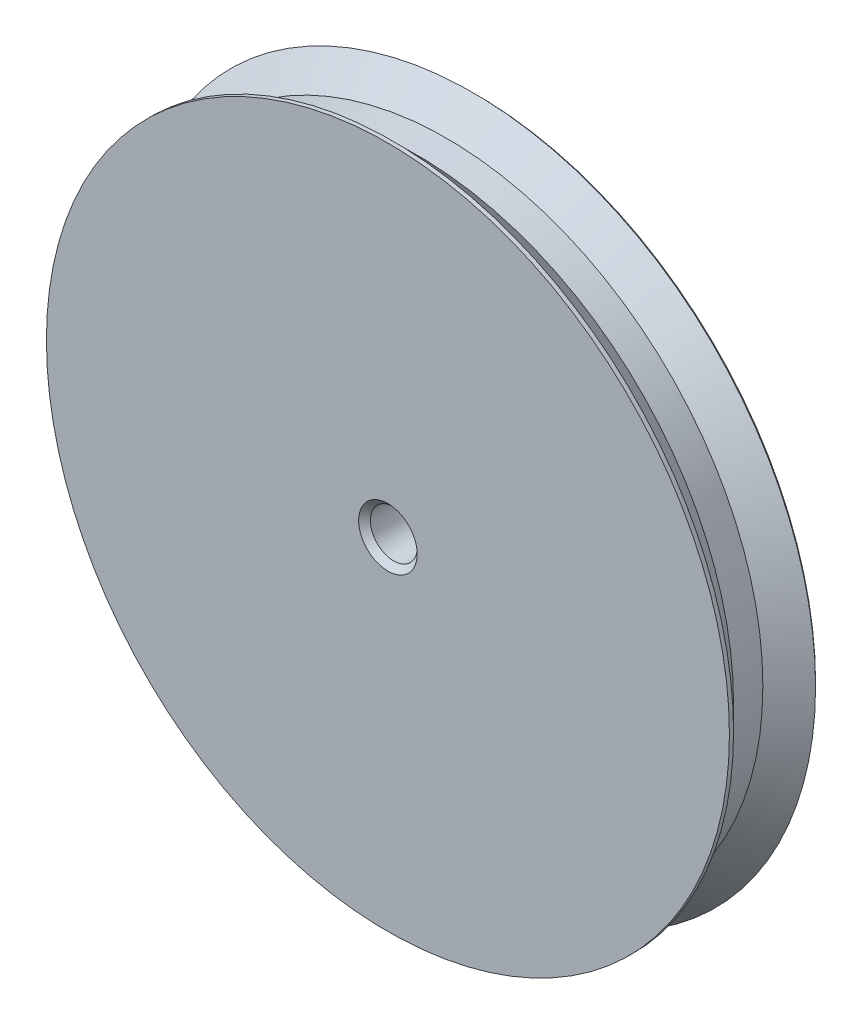
ISO-10303-21;
HEADER;
FILE_DESCRIPTION(('STEP AP214'),'2;1');
FILE_NAME('part.step','',(''),(''),'','','');
FILE_SCHEMA(('AUTOMOTIVE_DESIGN { 1 0 10303 214 1 1 1 1 }'));
ENDSEC;
DATA;
#1=APPLICATION_CONTEXT('core data for automotive mechanical design processes');
#2=APPLICATION_PROTOCOL_DEFINITION('international standard','automotive_design',2000,#1);
#3=PRODUCT_CONTEXT('',#1,'mechanical');
#4=PRODUCT('Part','Part','',(#3));
#5=PRODUCT_RELATED_PRODUCT_CATEGORY('part','',(#4));
#6=PRODUCT_DEFINITION_FORMATION('','',#4);
#7=PRODUCT_DEFINITION_CONTEXT('part definition',#1,'design');
#8=PRODUCT_DEFINITION('design','',#6,#7);
#9=PRODUCT_DEFINITION_SHAPE('','',#8);
#10=(LENGTH_UNIT() NAMED_UNIT(*) SI_UNIT(.MILLI.,.METRE.));
#11=(NAMED_UNIT(*) PLANE_ANGLE_UNIT() SI_UNIT($,.RADIAN.));
#12=(NAMED_UNIT(*) SI_UNIT($,.STERADIAN.) SOLID_ANGLE_UNIT());
#13=UNCERTAINTY_MEASURE_WITH_UNIT(LENGTH_MEASURE(1.E-05),#10,'distance_accuracy_value','');
#14=(GEOMETRIC_REPRESENTATION_CONTEXT(3) GLOBAL_UNCERTAINTY_ASSIGNED_CONTEXT((#13)) GLOBAL_UNIT_ASSIGNED_CONTEXT((#10,
#11,#12)) REPRESENTATION_CONTEXT('',''));
#15=CARTESIAN_POINT('',(0.,0.,0.));
#16=DIRECTION('',(0.,0.,1.));
#17=DIRECTION('',(1.,0.,0.));
#18=AXIS2_PLACEMENT_3D('',#15,#16,#17);
#19=CARTESIAN_POINT('',(0.,0.,0.));
#20=DIRECTION('',(0.,0.,1.));
#21=DIRECTION('',(1.,0.,0.));
#22=AXIS2_PLACEMENT_3D('',#19,#20,#21);
#23=CYLINDRICAL_SURFACE('',#22,4.);
#24=CARTESIAN_POINT('',(0.,0.,-14.));
#25=DIRECTION('',(0.,0.,-1.));
#26=DIRECTION('',(-1.,0.,0.));
#27=AXIS2_PLACEMENT_3D('',#24,#25,#26);
#28=CIRCLE('',#27,4.);
#29=CARTESIAN_POINT('',(-4.,0.,-14.));
#30=VERTEX_POINT('',#29);
#31=EDGE_CURVE('E58',#30,#30,#28,.T.);
#32=ORIENTED_EDGE('',*,*,#31,.T.);
#33=EDGE_LOOP('',(#32));
#34=FACE_BOUND('',#33,.T.);
#35=CARTESIAN_POINT('',(0.,0.,-1.00000000000003));
#36=DIRECTION('',(0.,0.,1.));
#37=DIRECTION('',(1.,0.,0.));
#38=AXIS2_PLACEMENT_3D('',#35,#36,#37);
#39=CIRCLE('',#38,4.);
#40=CARTESIAN_POINT('',(4.,0.,-1.00000000000003));
#41=VERTEX_POINT('',#40);
#42=EDGE_CURVE('E64',#41,#41,#39,.T.);
#43=ORIENTED_EDGE('',*,*,#42,.T.);
#44=EDGE_LOOP('',(#43));
#45=FACE_BOUND('',#44,.T.);
#46=ADVANCED_FACE('F39',(#34,#45),#23,.F.);
#47=CARTESIAN_POINT('',(4.,0.,-15.));
#48=DIRECTION('',(0.,0.,-1.));
#49=DIRECTION('',(-1.,0.,0.));
#50=AXIS2_PLACEMENT_3D('',#47,#48,#49);
#51=PLANE('',#50);
#52=CARTESIAN_POINT('',(0.,0.,-15.));
#53=DIRECTION('',(0.,0.,-1.));
#54=DIRECTION('',(-1.,0.,0.));
#55=AXIS2_PLACEMENT_3D('',#52,#53,#54);
#56=CIRCLE('',#55,57.9999999999999);
#57=CARTESIAN_POINT('',(-57.9999999999999,0.,-15.));
#58=VERTEX_POINT('',#57);
#59=EDGE_CURVE('E68',#58,#58,#56,.T.);
#60=ORIENTED_EDGE('',*,*,#59,.T.);
#61=EDGE_LOOP('',(#60));
#62=FACE_BOUND('',#61,.T.);
#63=CARTESIAN_POINT('',(0.,0.,-15.));
#64=DIRECTION('',(0.,0.,-1.));
#65=DIRECTION('',(-1.,0.,0.));
#66=AXIS2_PLACEMENT_3D('',#63,#64,#65);
#67=CIRCLE('',#66,4.99999999999999);
#68=CARTESIAN_POINT('',(-4.99999999999999,0.,-15.));
#69=VERTEX_POINT('',#68);
#70=EDGE_CURVE('E72',#69,#69,#67,.F.);
#71=ORIENTED_EDGE('',*,*,#70,.T.);
#72=EDGE_LOOP('',(#71));
#73=FACE_BOUND('',#72,.T.);
#74=ADVANCED_FACE('F102',(#62,#73),#51,.T.);
#75=CARTESIAN_POINT('',(0.,0.,-10.));
#76=DIRECTION('',(0.,0.,-1.));
#77=DIRECTION('',(-1.,0.,0.));
#78=AXIS2_PLACEMENT_3D('',#75,#76,#77);
#79=CONICAL_SURFACE('',#78,54.,0.785398163397448);
#80=CARTESIAN_POINT('',(0.,0.,-14.5));
#81=DIRECTION('',(0.,0.,1.));
#82=DIRECTION('',(1.,0.,0.));
#83=AXIS2_PLACEMENT_3D('',#80,#81,#82);
#84=CIRCLE('',#83,58.5);
#85=CARTESIAN_POINT('',(58.5,0.,-14.5));
#86=VERTEX_POINT('',#85);
#87=EDGE_CURVE('E76',#86,#86,#84,.T.);
#88=ORIENTED_EDGE('',*,*,#87,.T.);
#89=EDGE_LOOP('',(#88));
#90=FACE_BOUND('',#89,.T.);
#91=CARTESIAN_POINT('',(0.,0.,-10.));
#92=DIRECTION('',(0.,0.,1.));
#93=DIRECTION('',(1.,0.,0.));
#94=AXIS2_PLACEMENT_3D('',#91,#92,#93);
#95=CIRCLE('',#94,54.);
#96=CARTESIAN_POINT('',(54.,0.,-10.));
#97=VERTEX_POINT('',#96);
#98=EDGE_CURVE('E80',#97,#97,#95,.T.);
#99=ORIENTED_EDGE('',*,*,#98,.F.);
#100=EDGE_LOOP('',(#99));
#101=FACE_BOUND('',#100,.T.);
#102=ADVANCED_FACE('F93',(#90,#101),#79,.T.);
#103=CARTESIAN_POINT('',(0.,0.,0.));
#104=DIRECTION('',(0.,0.,1.));
#105=DIRECTION('',(1.,0.,0.));
#106=AXIS2_PLACEMENT_3D('',#103,#104,#105);
#107=CYLINDRICAL_SURFACE('',#106,54.);
#108=ORIENTED_EDGE('',*,*,#98,.T.);
#109=EDGE_LOOP('',(#108));
#110=FACE_BOUND('',#109,.T.);
#111=CARTESIAN_POINT('',(0.,0.,-5.));
#112=DIRECTION('',(0.,0.,1.));
#113=DIRECTION('',(1.,0.,0.));
#114=AXIS2_PLACEMENT_3D('',#111,#112,#113);
#115=CIRCLE('',#114,54.);
#116=CARTESIAN_POINT('',(54.,0.,-5.));
#117=VERTEX_POINT('',#116);
#118=EDGE_CURVE('E84',#117,#117,#115,.T.);
#119=ORIENTED_EDGE('',*,*,#118,.F.);
#120=EDGE_LOOP('',(#119));
#121=FACE_BOUND('',#120,.T.);
#122=ADVANCED_FACE('F91',(#110,#121),#107,.T.);
#123=CARTESIAN_POINT('',(0.,0.,0.));
#124=DIRECTION('',(0.,0.,1.));
#125=DIRECTION('',(1.,0.,0.));
#126=AXIS2_PLACEMENT_3D('',#123,#124,#125);
#127=CONICAL_SURFACE('',#126,59.,0.785398163397447);
#128=CARTESIAN_POINT('',(0.,0.,-0.707106781186552));
#129=DIRECTION('',(0.,0.,-1.));
#130=DIRECTION('',(-1.,0.,0.));
#131=AXIS2_PLACEMENT_3D('',#128,#129,#130);
#132=CIRCLE('',#131,58.2928932188134);
#133=CARTESIAN_POINT('',(-58.2928932188134,0.,-0.707106781186552));
#134=VERTEX_POINT('',#133);
#135=EDGE_CURVE('E10',#134,#134,#132,.T.);
#136=ORIENTED_EDGE('',*,*,#135,.T.);
#137=EDGE_LOOP('',(#136));
#138=FACE_BOUND('',#137,.T.);
#139=ORIENTED_EDGE('',*,*,#118,.T.);
#140=EDGE_LOOP('',(#139));
#141=FACE_BOUND('',#140,.T.);
#142=ADVANCED_FACE('F89',(#138,#141),#127,.T.);
#143=CARTESIAN_POINT('',(4.,0.,0.));
#144=DIRECTION('',(0.,0.,1.));
#145=DIRECTION('',(1.,0.,0.));
#146=AXIS2_PLACEMENT_3D('',#143,#144,#145);
#147=PLANE('',#146);
#148=CARTESIAN_POINT('',(0.,0.,0.));
#149=DIRECTION('',(0.,0.,1.));
#150=DIRECTION('',(1.,0.,0.));
#151=AXIS2_PLACEMENT_3D('',#148,#149,#150);
#152=CIRCLE('',#151,5.00000000000003);
#153=CARTESIAN_POINT('',(5.00000000000003,0.,0.));
#154=VERTEX_POINT('',#153);
#155=EDGE_CURVE('E48',#154,#154,#152,.F.);
#156=ORIENTED_EDGE('',*,*,#155,.T.);
#157=EDGE_LOOP('',(#156));
#158=FACE_BOUND('',#157,.T.);
#159=CARTESIAN_POINT('',(0.,0.,0.));
#160=DIRECTION('',(0.,0.,1.));
#161=DIRECTION('',(1.,0.,0.));
#162=AXIS2_PLACEMENT_3D('',#159,#160,#161);
#163=CIRCLE('',#162,58.2928932188134);
#164=CARTESIAN_POINT('',(58.2928932188134,0.,0.));
#165=VERTEX_POINT('',#164);
#166=EDGE_CURVE('E53',#165,#165,#163,.T.);
#167=ORIENTED_EDGE('',*,*,#166,.T.);
#168=EDGE_LOOP('',(#167));
#169=FACE_BOUND('',#168,.T.);
#170=ADVANCED_FACE('F100',(#158,#169),#147,.T.);
#171=CARTESIAN_POINT('',(0.,0.,-14.5));
#172=DIRECTION('',(0.,0.,1.));
#173=DIRECTION('',(1.,0.,0.));
#174=AXIS2_PLACEMENT_3D('',#171,#172,#173);
#175=CONICAL_SURFACE('',#174,58.5,0.785398163397448);
#176=ORIENTED_EDGE('',*,*,#59,.F.);
#177=EDGE_LOOP('',(#176));
#178=FACE_BOUND('',#177,.T.);
#179=ORIENTED_EDGE('',*,*,#87,.F.);
#180=EDGE_LOOP('',(#179));
#181=FACE_BOUND('',#180,.T.);
#182=ADVANCED_FACE('F116',(#178,#181),#175,.T.);
#183=CARTESIAN_POINT('',(0.,0.,-15.));
#184=DIRECTION('',(0.,0.,-1.));
#185=DIRECTION('',(-1.,0.,0.));
#186=AXIS2_PLACEMENT_3D('',#183,#184,#185);
#187=CONICAL_SURFACE('',#186,4.99999999999999,0.785398163397441);
#188=ORIENTED_EDGE('',*,*,#31,.F.);
#189=EDGE_LOOP('',(#188));
#190=FACE_BOUND('',#189,.T.);
#191=ORIENTED_EDGE('',*,*,#70,.F.);
#192=EDGE_LOOP('',(#191));
#193=FACE_BOUND('',#192,.T.);
#194=ADVANCED_FACE('F122',(#190,#193),#187,.F.);
#195=CARTESIAN_POINT('',(0.,0.,-1.00000000000003));
#196=DIRECTION('',(0.,0.,1.));
#197=DIRECTION('',(1.,0.,0.));
#198=AXIS2_PLACEMENT_3D('',#195,#196,#197);
#199=CONICAL_SURFACE('',#198,4.,0.785398163397448);
#200=ORIENTED_EDGE('',*,*,#155,.F.);
#201=EDGE_LOOP('',(#200));
#202=FACE_BOUND('',#201,.T.);
#203=ORIENTED_EDGE('',*,*,#42,.F.);
#204=EDGE_LOOP('',(#203));
#205=FACE_BOUND('',#204,.T.);
#206=ADVANCED_FACE('F128',(#202,#205),#199,.F.);
#207=CARTESIAN_POINT('',(0.,0.,0.));
#208=DIRECTION('',(0.,0.,1.));
#209=DIRECTION('',(1.,0.,0.));
#210=AXIS2_PLACEMENT_3D('',#207,#208,#209);
#211=CYLINDRICAL_SURFACE('',#210,58.2928932188134);
#212=ORIENTED_EDGE('',*,*,#135,.F.);
#213=EDGE_LOOP('',(#212));
#214=FACE_BOUND('',#213,.T.);
#215=ORIENTED_EDGE('',*,*,#166,.F.);
#216=EDGE_LOOP('',(#215));
#217=FACE_BOUND('',#216,.T.);
#218=ADVANCED_FACE('F42',(#214,#217),#211,.T.);
#219=CLOSED_SHELL('',(#46,#74,#102,#122,#142,#170,#182,#194,#206,#218));
#220=MANIFOLD_SOLID_BREP('B2',#219);
#221=ADVANCED_BREP_SHAPE_REPRESENTATION('',(#18,#220),#14);
#222=SHAPE_DEFINITION_REPRESENTATION(#9,#221);
ENDSEC;
END-ISO-10303-21;
